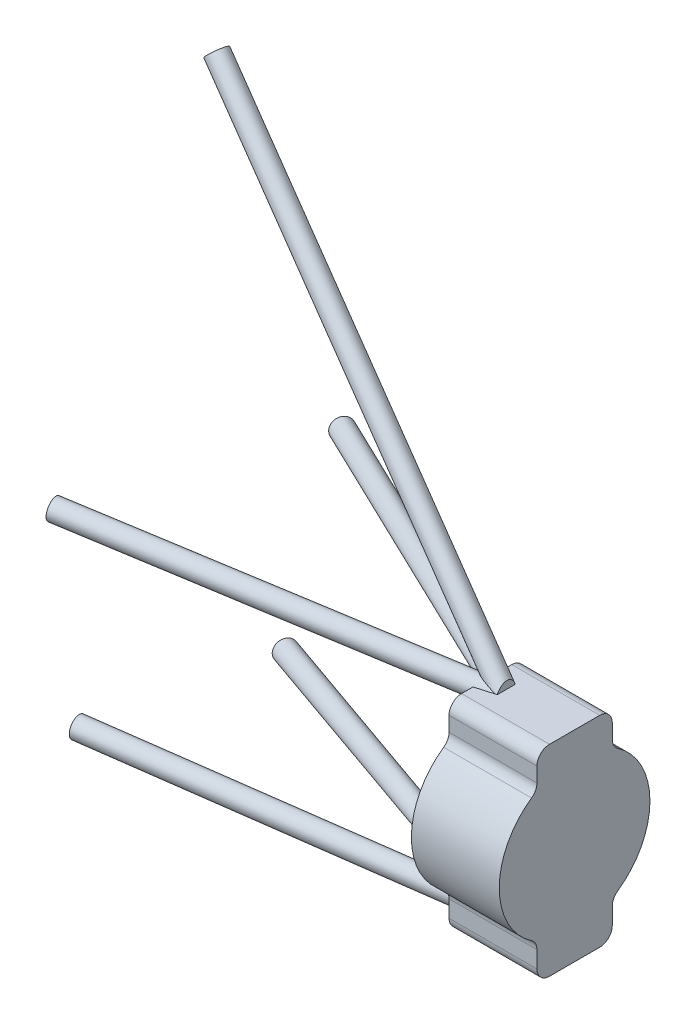
ISO-10303-21;
HEADER;
FILE_DESCRIPTION(('STEP AP214'),'2;1');
FILE_NAME('part.step','',(''),(''),'','','');
FILE_SCHEMA(('AUTOMOTIVE_DESIGN { 1 0 10303 214 1 1 1 1 }'));
ENDSEC;
DATA;
#1=APPLICATION_CONTEXT('core data for automotive mechanical design processes');
#2=APPLICATION_PROTOCOL_DEFINITION('international standard','automotive_design',2000,#1);
#3=PRODUCT_CONTEXT('',#1,'mechanical');
#4=PRODUCT('Part','Part','',(#3));
#5=PRODUCT_RELATED_PRODUCT_CATEGORY('part','',(#4));
#6=PRODUCT_DEFINITION_FORMATION('','',#4);
#7=PRODUCT_DEFINITION_CONTEXT('part definition',#1,'design');
#8=PRODUCT_DEFINITION('design','',#6,#7);
#9=PRODUCT_DEFINITION_SHAPE('','',#8);
#10=(LENGTH_UNIT() NAMED_UNIT(*) SI_UNIT(.MILLI.,.METRE.));
#11=(NAMED_UNIT(*) PLANE_ANGLE_UNIT() SI_UNIT($,.RADIAN.));
#12=(NAMED_UNIT(*) SI_UNIT($,.STERADIAN.) SOLID_ANGLE_UNIT());
#13=UNCERTAINTY_MEASURE_WITH_UNIT(LENGTH_MEASURE(1.E-05),#10,'distance_accuracy_value','');
#14=(GEOMETRIC_REPRESENTATION_CONTEXT(3) GLOBAL_UNCERTAINTY_ASSIGNED_CONTEXT((#13)) GLOBAL_UNIT_ASSIGNED_CONTEXT((#10,
#11,#12)) REPRESENTATION_CONTEXT('',''));
#15=CARTESIAN_POINT('',(0.,0.,0.));
#16=DIRECTION('',(0.,0.,1.));
#17=DIRECTION('',(1.,0.,0.));
#18=AXIS2_PLACEMENT_3D('',#15,#16,#17);
#19=CARTESIAN_POINT('',(535.,121.,0.));
#20=DIRECTION('',(0.,1.,0.));
#21=DIRECTION('',(0.,0.,1.));
#22=AXIS2_PLACEMENT_3D('',#19,#20,#21);
#23=PLANE('',#22);
#24=CARTESIAN_POINT('',(625.,121.,-615.470743605705));
#25=DIRECTION('',(0.,1.,0.));
#26=DIRECTION('',(-0.984919836826868,0.,0.173011314730962));
#27=AXIS2_PLACEMENT_3D('',#24,#25,#26);
#28=ELLIPSE('',#27,235.687976944856,8.00000000000003);
#29=CARTESIAN_POINT('',(480.,121.,-583.687334384309));
#30=VERTEX_POINT('',#29);
#31=CARTESIAN_POINT('',(465.,121.,-581.513610561944));
#32=VERTEX_POINT('',#31);
#33=EDGE_CURVE('E72',#30,#32,#28,.F.);
#34=ORIENTED_EDGE('',*,*,#33,.F.);
#35=DIRECTION('',(0.,0.,-1.));
#36=VECTOR('',#35,1.);
#37=CARTESIAN_POINT('',(480.,121.,0.));
#38=LINE('',#37,#36);
#39=CARTESIAN_POINT('',(480.,121.,-596.858117852031));
#40=VERTEX_POINT('',#39);
#41=EDGE_CURVE('E12',#30,#40,#38,.T.);
#42=ORIENTED_EDGE('',*,*,#41,.T.);
#43=CARTESIAN_POINT('',(407.5,121.,-618.637222806044));
#44=DIRECTION('',(0.,1.,0.));
#45=DIRECTION('',(0.930072822847603,0.,0.367375209017009));
#46=AXIS2_PLACEMENT_3D('',#43,#44,#45);
#47=ELLIPSE('',#46,124.977725042946,8.00000000000003);
#48=CARTESIAN_POINT('',(465.,121.,-603.506205639318));
#49=VERTEX_POINT('',#48);
#50=EDGE_CURVE('E224',#49,#40,#47,.F.);
#51=ORIENTED_EDGE('',*,*,#50,.F.);
#52=DIRECTION('',(0.,0.,-1.));
#53=VECTOR('',#52,1.);
#54=CARTESIAN_POINT('',(465.,121.,0.));
#55=LINE('',#54,#53);
#56=CARTESIAN_POINT('',(465.,121.,-610.));
#57=VERTEX_POINT('',#56);
#58=EDGE_CURVE('E269',#49,#57,#55,.T.);
#59=ORIENTED_EDGE('',*,*,#58,.T.);
#60=DIRECTION('',(-1.,0.,0.));
#61=VECTOR('',#60,1.);
#62=CARTESIAN_POINT('',(535.,121.,-610.));
#63=LINE('',#62,#61);
#64=CARTESIAN_POINT('',(535.,121.,-610.));
#65=VERTEX_POINT('',#64);
#66=EDGE_CURVE('E311',#57,#65,#63,.F.);
#67=ORIENTED_EDGE('',*,*,#66,.T.);
#68=DIRECTION('',(0.,0.,-1.));
#69=VECTOR('',#68,1.);
#70=CARTESIAN_POINT('',(535.,121.,0.));
#71=LINE('',#70,#69);
#72=CARTESIAN_POINT('',(535.,121.,-570.));
#73=VERTEX_POINT('',#72);
#74=EDGE_CURVE('E247',#73,#65,#71,.T.);
#75=ORIENTED_EDGE('',*,*,#74,.F.);
#76=DIRECTION('',(-1.,0.,0.));
#77=VECTOR('',#76,1.);
#78=CARTESIAN_POINT('',(535.,121.,-570.));
#79=LINE('',#78,#77);
#80=CARTESIAN_POINT('',(465.,121.,-570.));
#81=VERTEX_POINT('',#80);
#82=EDGE_CURVE('E313',#73,#81,#79,.T.);
#83=ORIENTED_EDGE('',*,*,#82,.T.);
#84=EDGE_CURVE('E270',#81,#32,#55,.T.);
#85=ORIENTED_EDGE('',*,*,#84,.T.);
#86=EDGE_LOOP('',(#34,#42,#51,#59,#67,#75,#83,#85));
#87=FACE_BOUND('',#86,.T.);
#88=ADVANCED_FACE('F54',(#87),#23,.F.);
#89=CARTESIAN_POINT('',(511.116094164574,273.854062471409,-597.51078135007));
#90=DIRECTION('',(-0.969905090031444,0.0668900062090649,0.234115021731727));
#91=DIRECTION('',(0.234640533103896,0.,0.972082208573287));
#92=AXIS2_PLACEMENT_3D('',#89,#90,#91);
#93=CYLINDRICAL_SURFACE('',#92,8.);
#94=CARTESIAN_POINT('',(190.,296.,-520.));
#95=DIRECTION('',(0.969905090031444,-0.0668900062090645,-0.234115021731728));
#96=DIRECTION('',(-0.234640533103897,0.,-0.972082208573287));
#97=AXIS2_PLACEMENT_3D('',#94,#95,#96);
#98=CIRCLE('',#97,8.);
#99=CARTESIAN_POINT('',(188.122875735169,296.,-527.776657668586));
#100=VERTEX_POINT('',#99);
#101=EDGE_CURVE('E290',#100,#100,#98,.T.);
#102=ORIENTED_EDGE('',*,*,#101,.T.);
#103=EDGE_LOOP('',(#102));
#104=FACE_BOUND('',#103,.T.);
#105=CARTESIAN_POINT('',(465.,277.034482758621,-586.379310344828));
#106=DIRECTION('',(1.,0.,0.));
#107=DIRECTION('',(0.,0.274721127897378,0.961523947640823));
#108=AXIS2_PLACEMENT_3D('',#105,#106,#107);
#109=ELLIPSE('',#108,8.2482297311592,8.);
#110=CARTESIAN_POINT('',(465.,281.,-579.161491685434));
#111=VERTEX_POINT('',#110);
#112=CARTESIAN_POINT('',(465.,270.063206504348,-590.561479475967));
#113=VERTEX_POINT('',#112);
#114=EDGE_CURVE('E282',#111,#113,#109,.T.);
#115=ORIENTED_EDGE('',*,*,#114,.F.);
#116=CARTESIAN_POINT('',(407.500000000001,281.,-572.5));
#117=DIRECTION('',(0.,1.,0.));
#118=DIRECTION('',(-0.972082208573287,0.,0.234640533103896));
#119=AXIS2_PLACEMENT_3D('',#116,#117,#118);
#120=ELLIPSE('',#119,119.599331101809,8.);
#121=CARTESIAN_POINT('',(478.518147982287,281.,-583.045655560998));
#122=VERTEX_POINT('',#121);
#123=EDGE_CURVE('E280',#111,#122,#120,.T.);
#124=ORIENTED_EDGE('',*,*,#123,.T.);
#125=CARTESIAN_POINT('',(480.,276.,-590.));
#126=DIRECTION('',(-0.324409978096139,-0.799427422100928,0.505642129281894));
#127=DIRECTION('',(-0.915263402952188,0.400265612961647,0.0456107695266876));
#128=AXIS2_PLACEMENT_3D('',#125,#126,#127);
#129=ELLIPSE('',#128,21.0775029286955,7.99999999999998);
#130=CARTESIAN_POINT('',(463.606851072773,280.453087507761,-593.477124859406));
#131=VERTEX_POINT('',#130);
#132=EDGE_CURVE('E288',#122,#131,#129,.T.);
#133=ORIENTED_EDGE('',*,*,#132,.T.);
#134=CARTESIAN_POINT('',(480.,276.,-590.));
#135=DIRECTION('',(-0.135168588119068,0.250864202622691,0.958538786188842));
#136=DIRECTION('',(0.990805622413367,0.0285568196526257,0.132244949413534));
#137=AXIS2_PLACEMENT_3D('',#134,#135,#136);
#138=ELLIPSE('',#137,21.4886626436982,8.);
#139=EDGE_CURVE('E294',#131,#113,#138,.T.);
#140=ORIENTED_EDGE('',*,*,#139,.T.);
#141=EDGE_LOOP('',(#115,#124,#133,#140));
#142=FACE_BOUND('',#141,.T.);
#143=ADVANCED_FACE('F390',(#104,#142),#93,.T.);
#144=CARTESIAN_POINT('',(190.,236.,-750.));
#145=DIRECTION('',(0.869261441528762,0.119898129866036,0.479592519464145));
#146=DIRECTION('',(0.483077342911335,0.,-0.875577684026794));
#147=AXIS2_PLACEMENT_3D('',#144,#145,#146);
#148=CYLINDRICAL_SURFACE('',#147,8.);
#149=CARTESIAN_POINT('',(190.,236.,-750.));
#150=DIRECTION('',(-0.869261441528762,-0.119898129866035,-0.479592519464144));
#151=DIRECTION('',(-0.477960879872597,0.451586908048764,0.753407367756892));
#152=AXIS2_PLACEMENT_3D('',#149,#150,#151);
#153=CIRCLE('',#152,8.);
#154=CARTESIAN_POINT('',(186.176312961019,239.61269526439,-743.972741057945));
#155=VERTEX_POINT('',#154);
#156=EDGE_CURVE('E291',#155,#155,#153,.T.);
#157=ORIENTED_EDGE('',*,*,#156,.F.);
#158=EDGE_LOOP('',(#157));
#159=FACE_BOUND('',#158,.T.);
#160=CARTESIAN_POINT('',(480.,276.,-590.));
#161=DIRECTION('',(0.167047494013726,0.91043565751986,0.378420464906584));
#162=DIRECTION('',(0.884931142325889,-0.307683013819203,0.349611264619618));
#163=AXIS2_PLACEMENT_3D('',#160,#161,#162);
#164=ELLIPSE('',#163,18.3547237538498,7.99999999999998);
#165=CARTESIAN_POINT('',(473.763170810238,281.,-599.276273157491));
#166=VERTEX_POINT('',#165);
#167=EDGE_CURVE('E297',#131,#166,#164,.F.);
#168=ORIENTED_EDGE('',*,*,#167,.T.);
#169=CARTESIAN_POINT('',(516.25,281.,-570.));
#170=DIRECTION('',(0.,1.,0.));
#171=DIRECTION('',(0.875577684026794,0.,0.483077342911335));
#172=AXIS2_PLACEMENT_3D('',#169,#170,#171);
#173=ELLIPSE('',#172,66.7233092704491,8.);
#174=CARTESIAN_POINT('',(465.,281.,-602.156160948246));
#175=VERTEX_POINT('',#174);
#176=EDGE_CURVE('E278',#166,#175,#173,.T.);
#177=ORIENTED_EDGE('',*,*,#176,.T.);
#178=CARTESIAN_POINT('',(465.,273.931034482759,-598.275862068966));
#179=DIRECTION('',(1.,0.,0.));
#180=DIRECTION('',(0.,0.242535625036333,0.970142500145332));
#181=AXIS2_PLACEMENT_3D('',#178,#179,#180);
#182=ELLIPSE('',#181,9.20321507178608,8.);
#183=EDGE_CURVE('E308',#113,#175,#182,.T.);
#184=ORIENTED_EDGE('',*,*,#183,.F.);
#185=ORIENTED_EDGE('',*,*,#139,.F.);
#186=EDGE_LOOP('',(#168,#177,#184,#185));
#187=FACE_BOUND('',#186,.T.);
#188=ADVANCED_FACE('F395',(#159,#187),#148,.T.);
#189=CARTESIAN_POINT('',(480.,276.,-590.));
#190=DIRECTION('',(-0.723644436333627,0.673737923483032,-0.149719538551785));
#191=DIRECTION('',(-0.681418527918843,-0.73189397443135,0.));
#192=AXIS2_PLACEMENT_3D('',#189,#190,#191);
#193=CYLINDRICAL_SURFACE('',#192,7.99999999999995);
#194=CARTESIAN_POINT('',(474.629629629629,281.,-591.111111111111));
#195=DIRECTION('',(0.,1.,0.));
#196=DIRECTION('',(-0.979260419507103,0.,-0.202605604035952));
#197=AXIS2_PLACEMENT_3D('',#194,#195,#196);
#198=ELLIPSE('',#197,11.8740532797119,7.99999999999995);
#199=CARTESIAN_POINT('',(480.,281.,-597.710972204488));
#200=VERTEX_POINT('',#199);
#201=EDGE_CURVE('E277',#166,#200,#198,.F.);
#202=ORIENTED_EDGE('',*,*,#201,.F.);
#203=ORIENTED_EDGE('',*,*,#167,.F.);
#204=ORIENTED_EDGE('',*,*,#132,.F.);
#205=CARTESIAN_POINT('',(480.,281.,-583.32087492927));
#206=VERTEX_POINT('',#205);
#207=EDGE_CURVE('E253',#206,#122,#198,.F.);
#208=ORIENTED_EDGE('',*,*,#207,.F.);
#209=CARTESIAN_POINT('',(480.,276.,-590.));
#210=DIRECTION('',(1.,0.,0.));
#211=DIRECTION('',(0.,0.976187060183953,-0.216930457818656));
#212=AXIS2_PLACEMENT_3D('',#209,#210,#211);
#213=ELLIPSE('',#212,11.0551530535248,7.99999999999995);
#214=EDGE_CURVE('E302',#206,#200,#213,.F.);
#215=ORIENTED_EDGE('',*,*,#214,.T.);
#216=EDGE_LOOP('',(#202,#203,#204,#208,#215));
#217=FACE_BOUND('',#216,.T.);
#218=CARTESIAN_POINT('',(190.,546.,-650.));
#219=DIRECTION('',(-0.723644436333627,0.673737923483032,-0.149719538551785));
#220=DIRECTION('',(-0.681418527918843,-0.73189397443135,0.));
#221=AXIS2_PLACEMENT_3D('',#218,#219,#220);
#222=CIRCLE('',#221,7.99999999999995);
#223=CARTESIAN_POINT('',(184.548651776649,540.144848204549,-650.));
#224=VERTEX_POINT('',#223);
#225=EDGE_CURVE('E285',#224,#224,#222,.T.);
#226=ORIENTED_EDGE('',*,*,#225,.F.);
#227=EDGE_LOOP('',(#226));
#228=FACE_BOUND('',#227,.T.);
#229=ADVANCED_FACE('F428',(#217,#228),#193,.T.);
#230=CARTESIAN_POINT('',(190.,296.,-520.));
#231=DIRECTION('',(0.969905090031444,-0.0668900062090645,-0.234115021731728));
#232=DIRECTION('',(-0.234640533103897,0.,-0.972082208573287));
#233=AXIS2_PLACEMENT_3D('',#230,#231,#232);
#234=PLANE('',#233);
#235=ORIENTED_EDGE('',*,*,#101,.F.);
#236=EDGE_LOOP('',(#235));
#237=FACE_BOUND('',#236,.T.);
#238=ADVANCED_FACE('F431',(#237),#234,.F.);
#239=CARTESIAN_POINT('',(190.,236.,-750.));
#240=DIRECTION('',(-0.869261441528762,-0.119898129866035,-0.479592519464144));
#241=DIRECTION('',(-0.477960879872597,0.451586908048764,0.753407367756892));
#242=AXIS2_PLACEMENT_3D('',#239,#240,#241);
#243=PLANE('',#242);
#244=ORIENTED_EDGE('',*,*,#156,.T.);
#245=EDGE_LOOP('',(#244));
#246=FACE_BOUND('',#245,.T.);
#247=ADVANCED_FACE('F433',(#246),#243,.T.);
#248=CARTESIAN_POINT('',(190.,546.,-650.));
#249=DIRECTION('',(-0.723644436333627,0.673737923483032,-0.149719538551785));
#250=DIRECTION('',(-0.681418527918843,-0.73189397443135,0.));
#251=AXIS2_PLACEMENT_3D('',#248,#249,#250);
#252=PLANE('',#251);
#253=ORIENTED_EDGE('',*,*,#225,.T.);
#254=EDGE_LOOP('',(#253));
#255=FACE_BOUND('',#254,.T.);
#256=ADVANCED_FACE('F426',(#255),#252,.T.);
#257=CARTESIAN_POINT('',(480.,346.,-619.094765483027));
#258=DIRECTION('',(1.,0.,0.));
#259=DIRECTION('',(0.,0.,-1.));
#260=AXIS2_PLACEMENT_3D('',#257,#258,#259);
#261=PLANE('',#260);
#262=DIRECTION('',(0.,0.,1.));
#263=VECTOR('',#262,1.);
#264=CARTESIAN_POINT('',(480.,281.,-619.094765483027));
#265=LINE('',#264,#263);
#266=EDGE_CURVE('E305',#200,#206,#265,.T.);
#267=ORIENTED_EDGE('',*,*,#266,.F.);
#268=ORIENTED_EDGE('',*,*,#214,.F.);
#269=EDGE_LOOP('',(#267,#268));
#270=FACE_BOUND('',#269,.T.);
#271=ADVANCED_FACE('F419',(#270),#261,.T.);
#272=CARTESIAN_POINT('',(535.,281.,0.));
#273=DIRECTION('',(0.,1.,0.));
#274=DIRECTION('',(0.,0.,1.));
#275=AXIS2_PLACEMENT_3D('',#272,#273,#274);
#276=PLANE('',#275);
#277=DIRECTION('',(0.,0.,-1.));
#278=VECTOR('',#277,1.);
#279=CARTESIAN_POINT('',(535.,281.,0.));
#280=LINE('',#279,#278);
#281=CARTESIAN_POINT('',(535.,281.,-570.));
#282=VERTEX_POINT('',#281);
#283=CARTESIAN_POINT('',(535.,281.,-610.));
#284=VERTEX_POINT('',#283);
#285=EDGE_CURVE('E240',#282,#284,#280,.T.);
#286=ORIENTED_EDGE('',*,*,#285,.T.);
#287=DIRECTION('',(-1.,0.,0.));
#288=VECTOR('',#287,1.);
#289=CARTESIAN_POINT('',(465.,281.,-610.));
#290=LINE('',#289,#288);
#291=CARTESIAN_POINT('',(465.,281.,-610.));
#292=VERTEX_POINT('',#291);
#293=EDGE_CURVE('E365',#284,#292,#290,.T.);
#294=ORIENTED_EDGE('',*,*,#293,.T.);
#295=DIRECTION('',(0.,0.,-1.));
#296=VECTOR('',#295,1.);
#297=CARTESIAN_POINT('',(465.,281.,0.));
#298=LINE('',#297,#296);
#299=EDGE_CURVE('E262',#175,#292,#298,.T.);
#300=ORIENTED_EDGE('',*,*,#299,.F.);
#301=ORIENTED_EDGE('',*,*,#176,.F.);
#302=ORIENTED_EDGE('',*,*,#201,.T.);
#303=ORIENTED_EDGE('',*,*,#266,.T.);
#304=ORIENTED_EDGE('',*,*,#207,.T.);
#305=ORIENTED_EDGE('',*,*,#123,.F.);
#306=CARTESIAN_POINT('',(465.,281.,-570.));
#307=VERTEX_POINT('',#306);
#308=EDGE_CURVE('E263',#307,#111,#298,.T.);
#309=ORIENTED_EDGE('',*,*,#308,.F.);
#310=DIRECTION('',(-1.,0.,0.));
#311=VECTOR('',#310,1.);
#312=CARTESIAN_POINT('',(535.,281.,-570.));
#313=LINE('',#312,#311);
#314=EDGE_CURVE('E363',#307,#282,#313,.F.);
#315=ORIENTED_EDGE('',*,*,#314,.T.);
#316=EDGE_LOOP('',(#286,#294,#300,#301,#302,#303,#304,#305,#309,#315));
#317=FACE_BOUND('',#316,.T.);
#318=ADVANCED_FACE('F416',(#317),#276,.T.);
#319=CARTESIAN_POINT('',(535.,201.874728277563,-590.));
#320=DIRECTION('',(-1.,0.,0.));
#321=DIRECTION('',(0.,0.,1.));
#322=AXIS2_PLACEMENT_3D('',#319,#320,#321);
#323=CYLINDRICAL_SURFACE('',#322,60.0000000000001);
#324=CARTESIAN_POINT('',(535.,201.874728277563,-590.));
#325=DIRECTION('',(1.,0.,0.));
#326=DIRECTION('',(0.,0.,-1.));
#327=AXIS2_PLACEMENT_3D('',#324,#325,#326);
#328=CIRCLE('',#327,60.0000000000001);
#329=CARTESIAN_POINT('',(535.,152.635619878666,-624.285714285714));
#330=VERTEX_POINT('',#329);
#331=CARTESIAN_POINT('',(535.,251.113836676461,-624.285714285714));
#332=VERTEX_POINT('',#331);
#333=EDGE_CURVE('E236',#330,#332,#328,.T.);
#334=ORIENTED_EDGE('',*,*,#333,.F.);
#335=DIRECTION('',(-1.,0.,0.));
#336=VECTOR('',#335,1.);
#337=CARTESIAN_POINT('',(535.,152.635619878666,-624.285714285714));
#338=LINE('',#337,#336);
#339=CARTESIAN_POINT('',(465.,152.635619878666,-624.285714285714));
#340=VERTEX_POINT('',#339);
#341=EDGE_CURVE('E345',#330,#340,#338,.T.);
#342=ORIENTED_EDGE('',*,*,#341,.T.);
#343=CARTESIAN_POINT('',(465.,201.874728277563,-590.));
#344=DIRECTION('',(1.,0.,0.));
#345=DIRECTION('',(0.,0.,-1.));
#346=AXIS2_PLACEMENT_3D('',#343,#344,#345);
#347=CIRCLE('',#346,60.0000000000001);
#348=CARTESIAN_POINT('',(465.,251.113836676461,-624.285714285714));
#349=VERTEX_POINT('',#348);
#350=EDGE_CURVE('E230',#340,#349,#347,.T.);
#351=ORIENTED_EDGE('',*,*,#350,.T.);
#352=DIRECTION('',(-1.,0.,0.));
#353=VECTOR('',#352,1.);
#354=CARTESIAN_POINT('',(535.,251.113836676461,-624.285714285714));
#355=LINE('',#354,#353);
#356=EDGE_CURVE('E343',#349,#332,#355,.F.);
#357=ORIENTED_EDGE('',*,*,#356,.T.);
#358=EDGE_LOOP('',(#334,#342,#351,#357));
#359=FACE_BOUND('',#358,.T.);
#360=ADVANCED_FACE('F411',(#359),#323,.T.);
#361=CARTESIAN_POINT('',(535.,46.,-620.));
#362=DIRECTION('',(0.,0.,1.));
#363=DIRECTION('',(1.,0.,0.));
#364=AXIS2_PLACEMENT_3D('',#361,#362,#363);
#365=PLANE('',#364);
#366=DIRECTION('',(0.,1.,0.));
#367=VECTOR('',#366,1.);
#368=CARTESIAN_POINT('',(535.,46.,-620.));
#369=LINE('',#368,#367);
#370=CARTESIAN_POINT('',(535.,259.320354742944,-620.));
#371=VERTEX_POINT('',#370);
#372=CARTESIAN_POINT('',(535.,271.,-620.));
#373=VERTEX_POINT('',#372);
#374=EDGE_CURVE('E237',#371,#373,#369,.T.);
#375=ORIENTED_EDGE('',*,*,#374,.F.);
#376=DIRECTION('',(1.,0.,0.));
#377=VECTOR('',#376,1.);
#378=CARTESIAN_POINT('',(465.,259.320354742944,-620.));
#379=LINE('',#378,#377);
#380=CARTESIAN_POINT('',(465.,259.320354742944,-620.));
#381=VERTEX_POINT('',#380);
#382=EDGE_CURVE('E355',#371,#381,#379,.F.);
#383=ORIENTED_EDGE('',*,*,#382,.T.);
#384=DIRECTION('',(0.,1.,0.));
#385=VECTOR('',#384,1.);
#386=CARTESIAN_POINT('',(465.,46.,-620.));
#387=LINE('',#386,#385);
#388=CARTESIAN_POINT('',(465.,271.,-620.));
#389=VERTEX_POINT('',#388);
#390=EDGE_CURVE('E259',#381,#389,#387,.T.);
#391=ORIENTED_EDGE('',*,*,#390,.T.);
#392=DIRECTION('',(-1.,0.,0.));
#393=VECTOR('',#392,1.);
#394=CARTESIAN_POINT('',(535.,271.,-620.));
#395=LINE('',#394,#393);
#396=EDGE_CURVE('E353',#389,#373,#395,.F.);
#397=ORIENTED_EDGE('',*,*,#396,.T.);
#398=EDGE_LOOP('',(#375,#383,#391,#397));
#399=FACE_BOUND('',#398,.T.);
#400=ADVANCED_FACE('F414',(#399),#365,.F.);
#401=CARTESIAN_POINT('',(535.,46.,-560.));
#402=DIRECTION('',(0.,0.,1.));
#403=DIRECTION('',(1.,0.,0.));
#404=AXIS2_PLACEMENT_3D('',#401,#402,#403);
#405=PLANE('',#404);
#406=DIRECTION('',(0.,1.,0.));
#407=VECTOR('',#406,1.);
#408=CARTESIAN_POINT('',(465.,46.,-560.));
#409=LINE('',#408,#407);
#410=CARTESIAN_POINT('',(465.,259.320354742944,-560.));
#411=VERTEX_POINT('',#410);
#412=CARTESIAN_POINT('',(465.,271.,-560.));
#413=VERTEX_POINT('',#412);
#414=EDGE_CURVE('E258',#411,#413,#409,.T.);
#415=ORIENTED_EDGE('',*,*,#414,.F.);
#416=DIRECTION('',(-1.,0.,0.));
#417=VECTOR('',#416,1.);
#418=CARTESIAN_POINT('',(535.,259.320354742944,-560.));
#419=LINE('',#418,#417);
#420=CARTESIAN_POINT('',(535.,259.320354742944,-560.));
#421=VERTEX_POINT('',#420);
#422=EDGE_CURVE('E361',#411,#421,#419,.F.);
#423=ORIENTED_EDGE('',*,*,#422,.T.);
#424=DIRECTION('',(0.,1.,0.));
#425=VECTOR('',#424,1.);
#426=CARTESIAN_POINT('',(535.,46.,-560.));
#427=LINE('',#426,#425);
#428=CARTESIAN_POINT('',(535.,271.,-560.));
#429=VERTEX_POINT('',#428);
#430=EDGE_CURVE('E235',#421,#429,#427,.T.);
#431=ORIENTED_EDGE('',*,*,#430,.T.);
#432=DIRECTION('',(-1.,0.,0.));
#433=VECTOR('',#432,1.);
#434=CARTESIAN_POINT('',(535.,271.,-560.));
#435=LINE('',#434,#433);
#436=EDGE_CURVE('E358',#429,#413,#435,.T.);
#437=ORIENTED_EDGE('',*,*,#436,.T.);
#438=EDGE_LOOP('',(#415,#423,#431,#437));
#439=FACE_BOUND('',#438,.T.);
#440=ADVANCED_FACE('F409',(#439),#405,.T.);
#441=CARTESIAN_POINT('',(465.,251.113836676461,-555.714285714286));
#442=VERTEX_POINT('',#441);
#443=CARTESIAN_POINT('',(465.,152.635619878666,-555.714285714286));
#444=VERTEX_POINT('',#443);
#445=EDGE_CURVE('E254',#442,#444,#347,.T.);
#446=ORIENTED_EDGE('',*,*,#445,.T.);
#447=DIRECTION('',(-1.,0.,0.));
#448=VECTOR('',#447,1.);
#449=CARTESIAN_POINT('',(535.,152.635619878666,-555.714285714286));
#450=LINE('',#449,#448);
#451=CARTESIAN_POINT('',(535.,152.635619878666,-555.714285714286));
#452=VERTEX_POINT('',#451);
#453=EDGE_CURVE('E351',#444,#452,#450,.F.);
#454=ORIENTED_EDGE('',*,*,#453,.T.);
#455=CARTESIAN_POINT('',(535.,251.113836676461,-555.714285714286));
#456=VERTEX_POINT('',#455);
#457=EDGE_CURVE('E231',#456,#452,#328,.T.);
#458=ORIENTED_EDGE('',*,*,#457,.F.);
#459=DIRECTION('',(-1.,0.,0.));
#460=VECTOR('',#459,1.);
#461=CARTESIAN_POINT('',(535.,251.113836676461,-555.714285714286));
#462=LINE('',#461,#460);
#463=EDGE_CURVE('E348',#456,#442,#462,.T.);
#464=ORIENTED_EDGE('',*,*,#463,.T.);
#465=EDGE_LOOP('',(#446,#454,#458,#464));
#466=FACE_BOUND('',#465,.T.);
#467=ADVANCED_FACE('F405',(#466),#323,.T.);
#468=CARTESIAN_POINT('',(535.,46.,-560.));
#469=DIRECTION('',(0.,0.,-1.));
#470=DIRECTION('',(-1.,0.,0.));
#471=AXIS2_PLACEMENT_3D('',#468,#469,#470);
#472=PLANE('',#471);
#473=DIRECTION('',(0.,-1.,0.));
#474=VECTOR('',#473,1.);
#475=CARTESIAN_POINT('',(465.,46.,-560.));
#476=LINE('',#475,#474);
#477=CARTESIAN_POINT('',(465.,144.429101812183,-560.));
#478=VERTEX_POINT('',#477);
#479=CARTESIAN_POINT('',(465.,131.,-560.));
#480=VERTEX_POINT('',#479);
#481=EDGE_CURVE('E257',#478,#480,#476,.T.);
#482=ORIENTED_EDGE('',*,*,#481,.T.);
#483=DIRECTION('',(-1.,0.,0.));
#484=VECTOR('',#483,1.);
#485=CARTESIAN_POINT('',(535.,131.,-560.));
#486=LINE('',#485,#484);
#487=CARTESIAN_POINT('',(535.,131.,-560.));
#488=VERTEX_POINT('',#487);
#489=EDGE_CURVE('E328',#480,#488,#486,.F.);
#490=ORIENTED_EDGE('',*,*,#489,.T.);
#491=DIRECTION('',(0.,-1.,0.));
#492=VECTOR('',#491,1.);
#493=CARTESIAN_POINT('',(535.,46.,-560.));
#494=LINE('',#493,#492);
#495=CARTESIAN_POINT('',(535.,144.429101812183,-560.));
#496=VERTEX_POINT('',#495);
#497=EDGE_CURVE('E234',#496,#488,#494,.T.);
#498=ORIENTED_EDGE('',*,*,#497,.F.);
#499=DIRECTION('',(1.,0.,0.));
#500=VECTOR('',#499,1.);
#501=CARTESIAN_POINT('',(465.,144.429101812183,-560.));
#502=LINE('',#501,#500);
#503=EDGE_CURVE('E325',#496,#478,#502,.F.);
#504=ORIENTED_EDGE('',*,*,#503,.T.);
#505=EDGE_LOOP('',(#482,#490,#498,#504));
#506=FACE_BOUND('',#505,.T.);
#507=ADVANCED_FACE('F402',(#506),#472,.F.);
#508=CARTESIAN_POINT('',(535.,46.,-620.));
#509=DIRECTION('',(0.,0.,-1.));
#510=DIRECTION('',(-1.,0.,0.));
#511=AXIS2_PLACEMENT_3D('',#508,#509,#510);
#512=PLANE('',#511);
#513=DIRECTION('',(0.,-1.,0.));
#514=VECTOR('',#513,1.);
#515=CARTESIAN_POINT('',(535.,46.,-620.));
#516=LINE('',#515,#514);
#517=CARTESIAN_POINT('',(535.,144.429101812183,-620.));
#518=VERTEX_POINT('',#517);
#519=CARTESIAN_POINT('',(535.,131.,-620.));
#520=VERTEX_POINT('',#519);
#521=EDGE_CURVE('E250',#518,#520,#516,.T.);
#522=ORIENTED_EDGE('',*,*,#521,.T.);
#523=DIRECTION('',(-1.,0.,0.));
#524=VECTOR('',#523,1.);
#525=CARTESIAN_POINT('',(465.,131.,-620.));
#526=LINE('',#525,#524);
#527=CARTESIAN_POINT('',(465.,131.,-620.));
#528=VERTEX_POINT('',#527);
#529=EDGE_CURVE('E340',#520,#528,#526,.T.);
#530=ORIENTED_EDGE('',*,*,#529,.T.);
#531=DIRECTION('',(0.,-1.,0.));
#532=VECTOR('',#531,1.);
#533=CARTESIAN_POINT('',(465.,46.,-620.));
#534=LINE('',#533,#532);
#535=CARTESIAN_POINT('',(465.,144.429101812183,-620.));
#536=VERTEX_POINT('',#535);
#537=EDGE_CURVE('E272',#536,#528,#534,.T.);
#538=ORIENTED_EDGE('',*,*,#537,.F.);
#539=DIRECTION('',(-1.,0.,0.));
#540=VECTOR('',#539,1.);
#541=CARTESIAN_POINT('',(535.,144.429101812183,-620.));
#542=LINE('',#541,#540);
#543=EDGE_CURVE('E338',#536,#518,#542,.F.);
#544=ORIENTED_EDGE('',*,*,#543,.T.);
#545=EDGE_LOOP('',(#522,#530,#538,#544));
#546=FACE_BOUND('',#545,.T.);
#547=ADVANCED_FACE('F400',(#546),#512,.T.);
#548=CARTESIAN_POINT('',(535.,46.,0.));
#549=DIRECTION('',(1.,0.,0.));
#550=DIRECTION('',(0.,0.,-1.));
#551=AXIS2_PLACEMENT_3D('',#548,#549,#550);
#552=PLANE('',#551);
#553=ORIENTED_EDGE('',*,*,#497,.T.);
#554=CARTESIAN_POINT('',(535.,131.,-570.));
#555=DIRECTION('',(1.,0.,0.));
#556=DIRECTION('',(0.,0.,-1.));
#557=AXIS2_PLACEMENT_3D('',#554,#555,#556);
#558=CIRCLE('',#557,10.);
#559=EDGE_CURVE('E336',#488,#73,#558,.T.);
#560=ORIENTED_EDGE('',*,*,#559,.T.);
#561=ORIENTED_EDGE('',*,*,#74,.T.);
#562=CARTESIAN_POINT('',(535.,131.,-610.));
#563=DIRECTION('',(1.,0.,0.));
#564=DIRECTION('',(0.,0.,-1.));
#565=AXIS2_PLACEMENT_3D('',#562,#563,#564);
#566=CIRCLE('',#565,10.);
#567=EDGE_CURVE('E334',#65,#520,#566,.T.);
#568=ORIENTED_EDGE('',*,*,#567,.T.);
#569=ORIENTED_EDGE('',*,*,#521,.F.);
#570=CARTESIAN_POINT('',(535.,144.429101812183,-630.));
#571=DIRECTION('',(1.,0.,0.));
#572=DIRECTION('',(0.,0.,-1.));
#573=AXIS2_PLACEMENT_3D('',#570,#571,#572);
#574=CIRCLE('',#573,10.);
#575=EDGE_CURVE('E370',#518,#330,#574,.F.);
#576=ORIENTED_EDGE('',*,*,#575,.T.);
#577=ORIENTED_EDGE('',*,*,#333,.T.);
#578=CARTESIAN_POINT('',(535.,259.320354742944,-630.));
#579=DIRECTION('',(1.,0.,0.));
#580=DIRECTION('',(0.,0.,-1.));
#581=AXIS2_PLACEMENT_3D('',#578,#579,#580);
#582=CIRCLE('',#581,10.);
#583=EDGE_CURVE('E378',#332,#371,#582,.F.);
#584=ORIENTED_EDGE('',*,*,#583,.T.);
#585=ORIENTED_EDGE('',*,*,#374,.T.);
#586=CARTESIAN_POINT('',(535.,271.,-610.));
#587=DIRECTION('',(1.,0.,0.));
#588=DIRECTION('',(0.,0.,-1.));
#589=AXIS2_PLACEMENT_3D('',#586,#587,#588);
#590=CIRCLE('',#589,10.);
#591=EDGE_CURVE('E332',#373,#284,#590,.T.);
#592=ORIENTED_EDGE('',*,*,#591,.T.);
#593=ORIENTED_EDGE('',*,*,#285,.F.);
#594=CARTESIAN_POINT('',(535.,271.,-570.));
#595=DIRECTION('',(1.,0.,0.));
#596=DIRECTION('',(0.,0.,-1.));
#597=AXIS2_PLACEMENT_3D('',#594,#595,#596);
#598=CIRCLE('',#597,10.);
#599=EDGE_CURVE('E330',#282,#429,#598,.T.);
#600=ORIENTED_EDGE('',*,*,#599,.T.);
#601=ORIENTED_EDGE('',*,*,#430,.F.);
#602=CARTESIAN_POINT('',(535.,259.320354742944,-550.));
#603=DIRECTION('',(1.,0.,0.));
#604=DIRECTION('',(0.,0.,-1.));
#605=AXIS2_PLACEMENT_3D('',#602,#603,#604);
#606=CIRCLE('',#605,10.);
#607=EDGE_CURVE('E382',#421,#456,#606,.F.);
#608=ORIENTED_EDGE('',*,*,#607,.T.);
#609=ORIENTED_EDGE('',*,*,#457,.T.);
#610=CARTESIAN_POINT('',(535.,144.429101812183,-550.));
#611=DIRECTION('',(1.,0.,0.));
#612=DIRECTION('',(0.,0.,-1.));
#613=AXIS2_PLACEMENT_3D('',#610,#611,#612);
#614=CIRCLE('',#613,10.);
#615=EDGE_CURVE('E374',#452,#496,#614,.F.);
#616=ORIENTED_EDGE('',*,*,#615,.T.);
#617=EDGE_LOOP('',(#553,#560,#561,#568,#569,#576,#577,#584,#585,#592,#593,#600,#601,#608,#609,#616));
#618=FACE_BOUND('',#617,.T.);
#619=ADVANCED_FACE('F481',(#618),#552,.T.);
#620=CARTESIAN_POINT('',(465.,46.,0.));
#621=DIRECTION('',(1.,0.,0.));
#622=DIRECTION('',(0.,0.,-1.));
#623=AXIS2_PLACEMENT_3D('',#620,#621,#622);
#624=PLANE('',#623);
#625=CARTESIAN_POINT('',(465.,126.51724137931,-587.365095489065));
#626=DIRECTION('',(1.,0.,0.));
#627=DIRECTION('',(0.,0.192627277046075,0.981271997021119));
#628=AXIS2_PLACEMENT_3D('',#625,#626,#627);
#629=ELLIPSE('',#628,8.12717161878814,8.00000000000003);
#630=CARTESIAN_POINT('',(465.,132.48716105032,-592.739868498816));
#631=VERTEX_POINT('',#630);
#632=EDGE_CURVE('E62',#32,#631,#629,.F.);
#633=ORIENTED_EDGE('',*,*,#632,.F.);
#634=ORIENTED_EDGE('',*,*,#84,.F.);
#635=CARTESIAN_POINT('',(465.,131.,-570.));
#636=DIRECTION('',(1.,0.,0.));
#637=DIRECTION('',(0.,0.,-1.));
#638=AXIS2_PLACEMENT_3D('',#635,#636,#637);
#639=CIRCLE('',#638,10.);
#640=EDGE_CURVE('E323',#81,#480,#639,.F.);
#641=ORIENTED_EDGE('',*,*,#640,.T.);
#642=ORIENTED_EDGE('',*,*,#481,.F.);
#643=CARTESIAN_POINT('',(465.,144.429101812183,-550.));
#644=DIRECTION('',(1.,0.,0.));
#645=DIRECTION('',(0.,0.,-1.));
#646=AXIS2_PLACEMENT_3D('',#643,#644,#645);
#647=CIRCLE('',#646,10.);
#648=EDGE_CURVE('E372',#478,#444,#647,.T.);
#649=ORIENTED_EDGE('',*,*,#648,.T.);
#650=ORIENTED_EDGE('',*,*,#445,.F.);
#651=CARTESIAN_POINT('',(465.,259.320354742944,-550.));
#652=DIRECTION('',(1.,0.,0.));
#653=DIRECTION('',(0.,0.,-1.));
#654=AXIS2_PLACEMENT_3D('',#651,#652,#653);
#655=CIRCLE('',#654,10.);
#656=EDGE_CURVE('E380',#442,#411,#655,.T.);
#657=ORIENTED_EDGE('',*,*,#656,.T.);
#658=ORIENTED_EDGE('',*,*,#414,.T.);
#659=CARTESIAN_POINT('',(465.,271.,-570.));
#660=DIRECTION('',(1.,0.,0.));
#661=DIRECTION('',(0.,0.,-1.));
#662=AXIS2_PLACEMENT_3D('',#659,#660,#661);
#663=CIRCLE('',#662,10.);
#664=EDGE_CURVE('E316',#413,#307,#663,.F.);
#665=ORIENTED_EDGE('',*,*,#664,.T.);
#666=ORIENTED_EDGE('',*,*,#308,.T.);
#667=ORIENTED_EDGE('',*,*,#114,.T.);
#668=ORIENTED_EDGE('',*,*,#183,.T.);
#669=ORIENTED_EDGE('',*,*,#299,.T.);
#670=CARTESIAN_POINT('',(465.,271.,-610.));
#671=DIRECTION('',(1.,0.,0.));
#672=DIRECTION('',(0.,0.,-1.));
#673=AXIS2_PLACEMENT_3D('',#670,#671,#672);
#674=CIRCLE('',#673,10.);
#675=EDGE_CURVE('E318',#292,#389,#674,.F.);
#676=ORIENTED_EDGE('',*,*,#675,.T.);
#677=ORIENTED_EDGE('',*,*,#390,.F.);
#678=CARTESIAN_POINT('',(465.,259.320354742944,-630.));
#679=DIRECTION('',(1.,0.,0.));
#680=DIRECTION('',(0.,0.,-1.));
#681=AXIS2_PLACEMENT_3D('',#678,#679,#680);
#682=CIRCLE('',#681,10.);
#683=EDGE_CURVE('E376',#381,#349,#682,.T.);
#684=ORIENTED_EDGE('',*,*,#683,.T.);
#685=ORIENTED_EDGE('',*,*,#350,.F.);
#686=CARTESIAN_POINT('',(465.,144.429101812183,-630.));
#687=DIRECTION('',(1.,0.,0.));
#688=DIRECTION('',(0.,0.,-1.));
#689=AXIS2_PLACEMENT_3D('',#686,#687,#688);
#690=CIRCLE('',#689,10.);
#691=EDGE_CURVE('E368',#340,#536,#690,.T.);
#692=ORIENTED_EDGE('',*,*,#691,.T.);
#693=ORIENTED_EDGE('',*,*,#537,.T.);
#694=CARTESIAN_POINT('',(465.,131.,-610.));
#695=DIRECTION('',(1.,0.,0.));
#696=DIRECTION('',(0.,0.,-1.));
#697=AXIS2_PLACEMENT_3D('',#694,#695,#696);
#698=CIRCLE('',#697,10.);
#699=EDGE_CURVE('E320',#528,#57,#698,.F.);
#700=ORIENTED_EDGE('',*,*,#699,.T.);
#701=ORIENTED_EDGE('',*,*,#58,.F.);
#702=CARTESIAN_POINT('',(465.,124.965517241379,-595.924942649526));
#703=DIRECTION('',(1.,0.,0.));
#704=DIRECTION('',(0.,0.171996015790114,0.985097645186672));
#705=AXIS2_PLACEMENT_3D('',#702,#703,#704);
#706=ELLIPSE('',#705,8.61915345123766,8.00000000000003);
#707=EDGE_CURVE('E384',#631,#49,#706,.F.);
#708=ORIENTED_EDGE('',*,*,#707,.F.);
#709=EDGE_LOOP('',(#633,#634,#641,#642,#649,#650,#657,#658,#665,#666,#667,#668,#669,#676,#677,
#684,#685,#692,#693,#700,#701,#708));
#710=FACE_BOUND('',#709,.T.);
#711=ADVANCED_FACE('F386',(#710),#624,.F.);
#712=CARTESIAN_POINT('',(535.,131.,-570.));
#713=DIRECTION('',(-1.,0.,0.));
#714=DIRECTION('',(0.,0.,1.));
#715=AXIS2_PLACEMENT_3D('',#712,#713,#714);
#716=CYLINDRICAL_SURFACE('',#715,10.);
#717=ORIENTED_EDGE('',*,*,#559,.F.);
#718=ORIENTED_EDGE('',*,*,#489,.F.);
#719=ORIENTED_EDGE('',*,*,#640,.F.);
#720=ORIENTED_EDGE('',*,*,#82,.F.);
#721=EDGE_LOOP('',(#717,#718,#719,#720));
#722=FACE_BOUND('',#721,.T.);
#723=ADVANCED_FACE('F446',(#722),#716,.T.);
#724=CARTESIAN_POINT('',(535.,131.,-610.));
#725=DIRECTION('',(1.,0.,0.));
#726=DIRECTION('',(0.,0.,-1.));
#727=AXIS2_PLACEMENT_3D('',#724,#725,#726);
#728=CYLINDRICAL_SURFACE('',#727,10.);
#729=ORIENTED_EDGE('',*,*,#567,.F.);
#730=ORIENTED_EDGE('',*,*,#66,.F.);
#731=ORIENTED_EDGE('',*,*,#699,.F.);
#732=ORIENTED_EDGE('',*,*,#529,.F.);
#733=EDGE_LOOP('',(#729,#730,#731,#732));
#734=FACE_BOUND('',#733,.T.);
#735=ADVANCED_FACE('F449',(#734),#728,.T.);
#736=CARTESIAN_POINT('',(535.,144.429101812183,-630.));
#737=DIRECTION('',(-1.,0.,0.));
#738=DIRECTION('',(0.,0.,1.));
#739=AXIS2_PLACEMENT_3D('',#736,#737,#738);
#740=CYLINDRICAL_SURFACE('',#739,10.);
#741=ORIENTED_EDGE('',*,*,#575,.F.);
#742=ORIENTED_EDGE('',*,*,#543,.F.);
#743=ORIENTED_EDGE('',*,*,#691,.F.);
#744=ORIENTED_EDGE('',*,*,#341,.F.);
#745=EDGE_LOOP('',(#741,#742,#743,#744));
#746=FACE_BOUND('',#745,.T.);
#747=ADVANCED_FACE('F453',(#746),#740,.F.);
#748=CARTESIAN_POINT('',(535.,144.429101812183,-550.));
#749=DIRECTION('',(-1.,0.,0.));
#750=DIRECTION('',(0.,0.,1.));
#751=AXIS2_PLACEMENT_3D('',#748,#749,#750);
#752=CYLINDRICAL_SURFACE('',#751,10.);
#753=ORIENTED_EDGE('',*,*,#615,.F.);
#754=ORIENTED_EDGE('',*,*,#453,.F.);
#755=ORIENTED_EDGE('',*,*,#648,.F.);
#756=ORIENTED_EDGE('',*,*,#503,.F.);
#757=EDGE_LOOP('',(#753,#754,#755,#756));
#758=FACE_BOUND('',#757,.T.);
#759=ADVANCED_FACE('F457',(#758),#752,.F.);
#760=CARTESIAN_POINT('',(535.,259.320354742944,-630.));
#761=DIRECTION('',(-1.,0.,0.));
#762=DIRECTION('',(0.,0.,1.));
#763=AXIS2_PLACEMENT_3D('',#760,#761,#762);
#764=CYLINDRICAL_SURFACE('',#763,10.);
#765=ORIENTED_EDGE('',*,*,#583,.F.);
#766=ORIENTED_EDGE('',*,*,#356,.F.);
#767=ORIENTED_EDGE('',*,*,#683,.F.);
#768=ORIENTED_EDGE('',*,*,#382,.F.);
#769=EDGE_LOOP('',(#765,#766,#767,#768));
#770=FACE_BOUND('',#769,.T.);
#771=ADVANCED_FACE('F461',(#770),#764,.F.);
#772=CARTESIAN_POINT('',(535.,259.320354742944,-550.));
#773=DIRECTION('',(-1.,0.,0.));
#774=DIRECTION('',(0.,0.,1.));
#775=AXIS2_PLACEMENT_3D('',#772,#773,#774);
#776=CYLINDRICAL_SURFACE('',#775,10.);
#777=ORIENTED_EDGE('',*,*,#607,.F.);
#778=ORIENTED_EDGE('',*,*,#422,.F.);
#779=ORIENTED_EDGE('',*,*,#656,.F.);
#780=ORIENTED_EDGE('',*,*,#463,.F.);
#781=EDGE_LOOP('',(#777,#778,#779,#780));
#782=FACE_BOUND('',#781,.T.);
#783=ADVANCED_FACE('F465',(#782),#776,.F.);
#784=CARTESIAN_POINT('',(535.,271.,-610.));
#785=DIRECTION('',(1.,0.,0.));
#786=DIRECTION('',(0.,0.,-1.));
#787=AXIS2_PLACEMENT_3D('',#784,#785,#786);
#788=CYLINDRICAL_SURFACE('',#787,10.);
#789=ORIENTED_EDGE('',*,*,#591,.F.);
#790=ORIENTED_EDGE('',*,*,#396,.F.);
#791=ORIENTED_EDGE('',*,*,#675,.F.);
#792=ORIENTED_EDGE('',*,*,#293,.F.);
#793=EDGE_LOOP('',(#789,#790,#791,#792));
#794=FACE_BOUND('',#793,.T.);
#795=ADVANCED_FACE('F468',(#794),#788,.T.);
#796=CARTESIAN_POINT('',(535.,271.,-570.));
#797=DIRECTION('',(-1.,0.,0.));
#798=DIRECTION('',(0.,0.,1.));
#799=AXIS2_PLACEMENT_3D('',#796,#797,#798);
#800=CYLINDRICAL_SURFACE('',#799,10.);
#801=ORIENTED_EDGE('',*,*,#599,.F.);
#802=ORIENTED_EDGE('',*,*,#314,.F.);
#803=ORIENTED_EDGE('',*,*,#664,.F.);
#804=ORIENTED_EDGE('',*,*,#436,.F.);
#805=EDGE_LOOP('',(#801,#802,#803,#804));
#806=FACE_BOUND('',#805,.T.);
#807=ADVANCED_FACE('F56',(#806),#800,.T.);
#808=CARTESIAN_POINT('',(480.,346.,-619.094765483027));
#809=DIRECTION('',(1.,0.,0.));
#810=DIRECTION('',(0.,0.,-1.));
#811=AXIS2_PLACEMENT_3D('',#808,#809,#810);
#812=PLANE('',#811);
#813=ORIENTED_EDGE('',*,*,#41,.F.);
#814=CARTESIAN_POINT('',(480.,126.,-590.));
#815=DIRECTION('',(1.,0.,0.));
#816=DIRECTION('',(0.,0.192627277046075,0.981271997021119));
#817=AXIS2_PLACEMENT_3D('',#814,#815,#816);
#818=ELLIPSE('',#817,8.12717161878814,8.00000000000003);
#819=CARTESIAN_POINT('',(480.,118.128650573223,-588.570922957952));
#820=VERTEX_POINT('',#819);
#821=EDGE_CURVE('E207',#30,#820,#818,.T.);
#822=ORIENTED_EDGE('',*,*,#821,.T.);
#823=CARTESIAN_POINT('',(480.,126.,-590.));
#824=DIRECTION('',(1.,0.,0.));
#825=DIRECTION('',(0.,0.171996015790114,0.985097645186672));
#826=AXIS2_PLACEMENT_3D('',#823,#824,#825);
#827=ELLIPSE('',#826,8.61915345123766,8.00000000000003);
#828=EDGE_CURVE('E211',#820,#40,#827,.T.);
#829=ORIENTED_EDGE('',*,*,#828,.T.);
#830=EDGE_LOOP('',(#813,#822,#829));
#831=FACE_BOUND('',#830,.T.);
#832=ADVANCED_FACE('F209',(#831),#812,.T.);
#833=CARTESIAN_POINT('',(520.431233954224,124.60581951882,-597.102162715243));
#834=DIRECTION('',(-0.984352290716476,0.0339431824384992,0.172911619410533));
#835=DIRECTION('',(0.173011314730962,0.,0.984919836826868));
#836=AXIS2_PLACEMENT_3D('',#833,#834,#835);
#837=CYLINDRICAL_SURFACE('',#836,8.00000000000003);
#838=CARTESIAN_POINT('',(190.,136.,-539.058512788591));
#839=DIRECTION('',(0.984352290716476,-0.0339431824384993,-0.172911619410532));
#840=DIRECTION('',(-0.173011314730961,0.,-0.984919836826868));
#841=AXIS2_PLACEMENT_3D('',#838,#839,#840);
#842=CIRCLE('',#841,8.00000000000003);
#843=CARTESIAN_POINT('',(188.615909482152,136.,-546.937871483206));
#844=VERTEX_POINT('',#843);
#845=EDGE_CURVE('E213',#844,#844,#842,.T.);
#846=ORIENTED_EDGE('',*,*,#845,.T.);
#847=EDGE_LOOP('',(#846));
#848=FACE_BOUND('',#847,.T.);
#849=ORIENTED_EDGE('',*,*,#821,.F.);
#850=ORIENTED_EDGE('',*,*,#33,.T.);
#851=ORIENTED_EDGE('',*,*,#632,.T.);
#852=CARTESIAN_POINT('',(479.999999999999,126.,-590.));
#853=DIRECTION('',(-0.101931064535918,0.177703645989643,0.978790821516304));
#854=DIRECTION('',(0.994788075202843,0.0156398611174435,0.100757531621458));
#855=AXIS2_PLACEMENT_3D('',#852,#853,#854);
#856=ELLIPSE('',#855,29.0262902190415,8.00000000000003);
#857=EDGE_CURVE('E217',#631,#820,#856,.T.);
#858=ORIENTED_EDGE('',*,*,#857,.T.);
#859=EDGE_LOOP('',(#849,#850,#851,#858));
#860=FACE_BOUND('',#859,.T.);
#861=ADVANCED_FACE('F218',(#848,#860),#837,.T.);
#862=CARTESIAN_POINT('',(190.,106.,-704.548891224176));
#863=DIRECTION('',(0.928165398755173,0.0640114068107016,0.366621783793278));
#864=DIRECTION('',(0.367375209017009,0.,-0.930072822847603));
#865=AXIS2_PLACEMENT_3D('',#862,#863,#864);
#866=CYLINDRICAL_SURFACE('',#865,8.00000000000003);
#867=CARTESIAN_POINT('',(190.,106.,-704.548891224176));
#868=DIRECTION('',(-0.928165398755173,-0.064011406810702,-0.366621783793278));
#869=DIRECTION('',(-0.365945469157404,0.336355779600695,0.867726168288347));
#870=AXIS2_PLACEMENT_3D('',#867,#868,#869);
#871=CIRCLE('',#870,8.00000000000003);
#872=CARTESIAN_POINT('',(187.072436246741,108.690846236806,-697.607081877869));
#873=VERTEX_POINT('',#872);
#874=EDGE_CURVE('E221',#873,#873,#871,.T.);
#875=ORIENTED_EDGE('',*,*,#874,.F.);
#876=EDGE_LOOP('',(#875));
#877=FACE_BOUND('',#876,.T.);
#878=ORIENTED_EDGE('',*,*,#707,.T.);
#879=ORIENTED_EDGE('',*,*,#50,.T.);
#880=ORIENTED_EDGE('',*,*,#828,.F.);
#881=ORIENTED_EDGE('',*,*,#857,.F.);
#882=EDGE_LOOP('',(#878,#879,#880,#881));
#883=FACE_BOUND('',#882,.T.);
#884=ADVANCED_FACE('F223',(#877,#883),#866,.T.);
#885=CARTESIAN_POINT('',(190.,136.,-539.058512788591));
#886=DIRECTION('',(0.984352290716476,-0.0339431824384993,-0.172911619410532));
#887=DIRECTION('',(-0.173011314730961,0.,-0.984919836826868));
#888=AXIS2_PLACEMENT_3D('',#885,#886,#887);
#889=PLANE('',#888);
#890=ORIENTED_EDGE('',*,*,#845,.F.);
#891=EDGE_LOOP('',(#890));
#892=FACE_BOUND('',#891,.T.);
#893=ADVANCED_FACE('F646',(#892),#889,.F.);
#894=CARTESIAN_POINT('',(190.,106.,-704.548891224176));
#895=DIRECTION('',(-0.928165398755173,-0.064011406810702,-0.366621783793278));
#896=DIRECTION('',(-0.365945469157404,0.336355779600695,0.867726168288347));
#897=AXIS2_PLACEMENT_3D('',#894,#895,#896);
#898=PLANE('',#897);
#899=ORIENTED_EDGE('',*,*,#874,.T.);
#900=EDGE_LOOP('',(#899));
#901=FACE_BOUND('',#900,.T.);
#902=ADVANCED_FACE('F649',(#901),#898,.T.);
#903=CLOSED_SHELL('',(#88,#143,#188,#229,#238,#247,#256,#271,#318,#360,#400,#440,#467,#507,#547,
#619,#711,#723,#735,#747,#759,#771,#783,#795,#807,#832,#861,#884,#893,#902));
#904=MANIFOLD_SOLID_BREP('B2',#903);
#905=ADVANCED_BREP_SHAPE_REPRESENTATION('',(#18,#904),#14);
#906=SHAPE_DEFINITION_REPRESENTATION(#9,#905);
ENDSEC;
END-ISO-10303-21;
